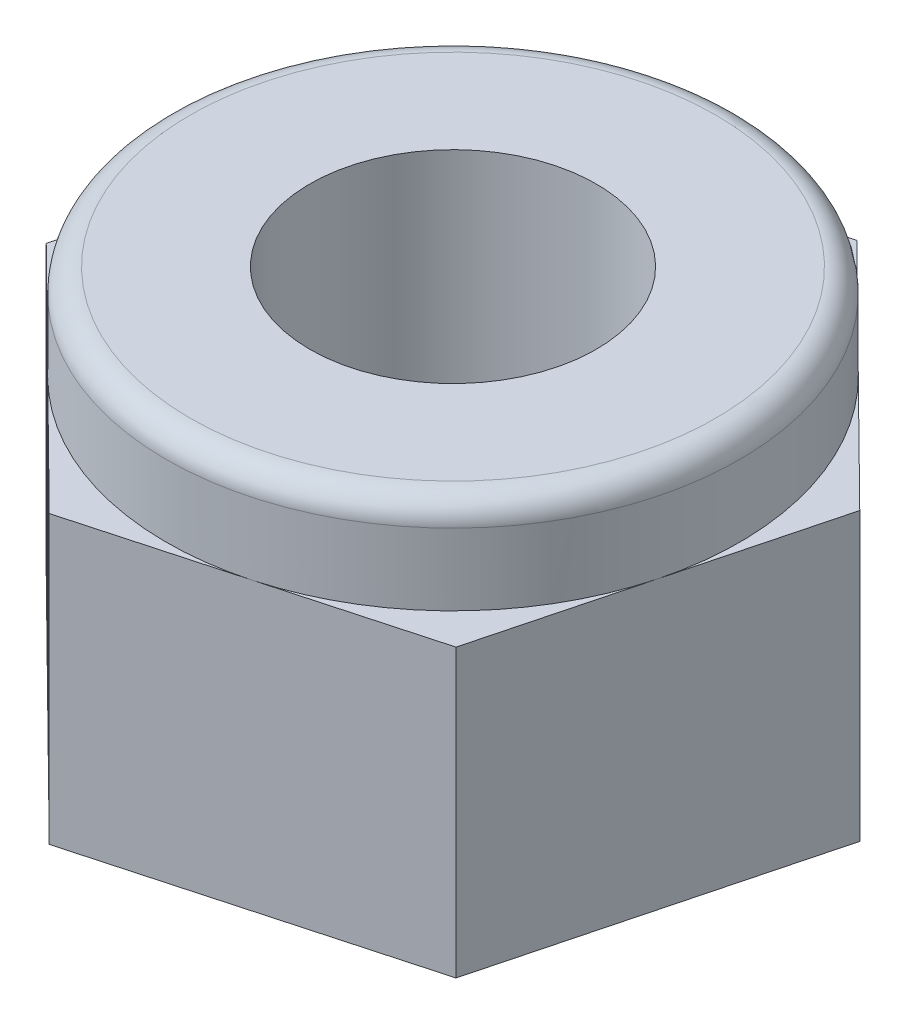
ISO-10303-21;
HEADER;
FILE_DESCRIPTION(('STEP AP214'),'2;1');
FILE_NAME('part.step','',(''),(''),'','','');
FILE_SCHEMA(('AUTOMOTIVE_DESIGN { 1 0 10303 214 1 1 1 1 }'));
ENDSEC;
DATA;
#1=APPLICATION_CONTEXT('core data for automotive mechanical design processes');
#2=APPLICATION_PROTOCOL_DEFINITION('international standard','automotive_design',2000,#1);
#3=PRODUCT_CONTEXT('',#1,'mechanical');
#4=PRODUCT('Part','Part','',(#3));
#5=PRODUCT_RELATED_PRODUCT_CATEGORY('part','',(#4));
#6=PRODUCT_DEFINITION_FORMATION('','',#4);
#7=PRODUCT_DEFINITION_CONTEXT('part definition',#1,'design');
#8=PRODUCT_DEFINITION('design','',#6,#7);
#9=PRODUCT_DEFINITION_SHAPE('','',#8);
#10=(LENGTH_UNIT() NAMED_UNIT(*) SI_UNIT(.MILLI.,.METRE.));
#11=(NAMED_UNIT(*) PLANE_ANGLE_UNIT() SI_UNIT($,.RADIAN.));
#12=(NAMED_UNIT(*) SI_UNIT($,.STERADIAN.) SOLID_ANGLE_UNIT());
#13=UNCERTAINTY_MEASURE_WITH_UNIT(LENGTH_MEASURE(1.E-05),#10,'distance_accuracy_value','');
#14=(GEOMETRIC_REPRESENTATION_CONTEXT(3) GLOBAL_UNCERTAINTY_ASSIGNED_CONTEXT((#13)) GLOBAL_UNIT_ASSIGNED_CONTEXT((#10,
#11,#12)) REPRESENTATION_CONTEXT('',''));
#15=CARTESIAN_POINT('',(0.,0.,0.));
#16=DIRECTION('',(0.,0.,1.));
#17=DIRECTION('',(1.,0.,0.));
#18=AXIS2_PLACEMENT_3D('',#15,#16,#17);
#19=CARTESIAN_POINT('',(0.,3.,0.));
#20=DIRECTION('',(0.,1.,0.));
#21=DIRECTION('',(0.,0.,1.));
#22=AXIS2_PLACEMENT_3D('',#19,#20,#21);
#23=PLANE('',#22);
#24=CARTESIAN_POINT('',(0.,3.,0.));
#25=DIRECTION('',(0.,1.,0.));
#26=DIRECTION('',(0.,0.,1.));
#27=AXIS2_PLACEMENT_3D('',#24,#25,#26);
#28=CIRCLE('',#27,3.00000000000001);
#29=CARTESIAN_POINT('',(0.79508564508505,3.,2.89272169711843));
#30=VERTEX_POINT('',#29);
#31=CARTESIAN_POINT('',(2.90271329832552,3.,0.757796481731226));
#32=VERTEX_POINT('',#31);
#33=EDGE_CURVE('E124',#30,#32,#28,.T.);
#34=ORIENTED_EDGE('',*,*,#33,.F.);
#35=DIRECTION('',(0.964240565706141,0.,-0.265028548361683));
#36=VECTOR('',#35,1.);
#37=CARTESIAN_POINT('',(-0.875028005436949,3.,3.35176460833709));
#38=LINE('',#37,#36);
#39=CARTESIAN_POINT('',(2.46519929560704,3.,2.43367878589977));
#40=VERTEX_POINT('',#39);
#41=EDGE_CURVE('E111',#30,#40,#38,.T.);
#42=ORIENTED_EDGE('',*,*,#41,.T.);
#43=DIRECTION('',(0.252598827243741,0.,-0.967571099441838));
#44=VECTOR('',#43,1.);
#45=CARTESIAN_POINT('',(2.46519929560704,3.,2.43367878589977));
#46=LINE('',#45,#44);
#47=EDGE_CURVE('E125',#40,#32,#46,.T.);
#48=ORIENTED_EDGE('',*,*,#47,.T.);
#49=EDGE_LOOP('',(#34,#42,#48));
#50=FACE_BOUND('',#49,.T.);
#51=ADVANCED_FACE('F33',(#50),#23,.T.);
#52=CARTESIAN_POINT('',(2.10762765324048,3.,-2.1349252153872));
#53=VERTEX_POINT('',#52);
#54=EDGE_CURVE('E131',#32,#53,#28,.T.);
#55=ORIENTED_EDGE('',*,*,#54,.F.);
#56=CARTESIAN_POINT('',(3.34022730104399,3.,-0.918085822437318));
#57=VERTEX_POINT('',#56);
#58=EDGE_CURVE('E110',#32,#57,#46,.T.);
#59=ORIENTED_EDGE('',*,*,#58,.T.);
#60=DIRECTION('',(-0.711641738462399,0.,-0.702542551080157));
#61=VECTOR('',#60,1.);
#62=CARTESIAN_POINT('',(3.34022730104399,3.,-0.918085822437318));
#63=LINE('',#62,#61);
#64=EDGE_CURVE('E142',#57,#53,#63,.T.);
#65=ORIENTED_EDGE('',*,*,#64,.T.);
#66=EDGE_LOOP('',(#55,#59,#65));
#67=FACE_BOUND('',#66,.T.);
#68=ADVANCED_FACE('F222',(#67),#23,.T.);
#69=CARTESIAN_POINT('',(-0.795085645085048,3.,-2.89272169711843));
#70=VERTEX_POINT('',#69);
#71=EDGE_CURVE('E180',#53,#70,#28,.T.);
#72=ORIENTED_EDGE('',*,*,#71,.F.);
#73=CARTESIAN_POINT('',(0.875028005436953,3.,-3.35176460833709));
#74=VERTEX_POINT('',#73);
#75=EDGE_CURVE('E141',#53,#74,#63,.T.);
#76=ORIENTED_EDGE('',*,*,#75,.T.);
#77=DIRECTION('',(-0.964240565706141,0.,0.265028548361682));
#78=VECTOR('',#77,1.);
#79=CARTESIAN_POINT('',(0.875028005436953,3.,-3.35176460833709));
#80=LINE('',#79,#78);
#81=EDGE_CURVE('E146',#74,#70,#80,.T.);
#82=ORIENTED_EDGE('',*,*,#81,.T.);
#83=EDGE_LOOP('',(#72,#76,#82));
#84=FACE_BOUND('',#83,.T.);
#85=ADVANCED_FACE('F191',(#84),#23,.T.);
#86=CARTESIAN_POINT('',(-2.90271329832552,3.,-0.757796481731226));
#87=VERTEX_POINT('',#86);
#88=EDGE_CURVE('E134',#70,#87,#28,.T.);
#89=ORIENTED_EDGE('',*,*,#88,.F.);
#90=CARTESIAN_POINT('',(-2.46519929560704,3.,-2.43367878589978));
#91=VERTEX_POINT('',#90);
#92=EDGE_CURVE('E145',#70,#91,#80,.T.);
#93=ORIENTED_EDGE('',*,*,#92,.T.);
#94=DIRECTION('',(-0.252598827243741,0.,0.967571099441838));
#95=VECTOR('',#94,1.);
#96=CARTESIAN_POINT('',(-2.46519929560704,3.,-2.43367878589978));
#97=LINE('',#96,#95);
#98=EDGE_CURVE('E150',#91,#87,#97,.T.);
#99=ORIENTED_EDGE('',*,*,#98,.T.);
#100=EDGE_LOOP('',(#89,#93,#99));
#101=FACE_BOUND('',#100,.T.);
#102=ADVANCED_FACE('F184',(#101),#23,.T.);
#103=CARTESIAN_POINT('',(-2.10762765324047,3.,2.1349252153872));
#104=VERTEX_POINT('',#103);
#105=EDGE_CURVE('E56',#87,#104,#28,.T.);
#106=ORIENTED_EDGE('',*,*,#105,.F.);
#107=CARTESIAN_POINT('',(-3.34022730104399,3.,0.91808582243732));
#108=VERTEX_POINT('',#107);
#109=EDGE_CURVE('E149',#87,#108,#97,.T.);
#110=ORIENTED_EDGE('',*,*,#109,.T.);
#111=DIRECTION('',(0.7116417384624,0.,0.702542551080156));
#112=VECTOR('',#111,1.);
#113=CARTESIAN_POINT('',(-3.34022730104399,3.,0.91808582243732));
#114=LINE('',#113,#112);
#115=EDGE_CURVE('E153',#108,#104,#114,.T.);
#116=ORIENTED_EDGE('',*,*,#115,.T.);
#117=EDGE_LOOP('',(#106,#110,#116));
#118=FACE_BOUND('',#117,.T.);
#119=ADVANCED_FACE('F210',(#118),#23,.T.);
#120=CARTESIAN_POINT('',(-0.875028005436949,3.,3.35176460833709));
#121=DIRECTION('',(-0.265028548361683,0.,-0.964240565706141));
#122=DIRECTION('',(-0.964240565706141,0.,0.265028548361683));
#123=AXIS2_PLACEMENT_3D('',#120,#121,#122);
#124=PLANE('',#123);
#125=DIRECTION('',(0.964240565706141,0.,-0.265028548361683));
#126=VECTOR('',#125,1.);
#127=CARTESIAN_POINT('',(-0.875028005436949,0.,3.35176460833709));
#128=LINE('',#127,#126);
#129=CARTESIAN_POINT('',(-0.875028005436949,0.,3.35176460833709));
#130=VERTEX_POINT('',#129);
#131=CARTESIAN_POINT('',(2.46519929560704,0.,2.43367878589977));
#132=VERTEX_POINT('',#131);
#133=EDGE_CURVE('E128',#130,#132,#128,.T.);
#134=ORIENTED_EDGE('',*,*,#133,.T.);
#135=DIRECTION('',(0.,-1.,0.));
#136=VECTOR('',#135,1.);
#137=CARTESIAN_POINT('',(2.46519929560704,3.,2.43367878589977));
#138=LINE('',#137,#136);
#139=EDGE_CURVE('E118',#40,#132,#138,.T.);
#140=ORIENTED_EDGE('',*,*,#139,.F.);
#141=ORIENTED_EDGE('',*,*,#41,.F.);
#142=CARTESIAN_POINT('',(-0.875028005436949,3.,3.35176460833709));
#143=VERTEX_POINT('',#142);
#144=EDGE_CURVE('E103',#143,#30,#38,.T.);
#145=ORIENTED_EDGE('',*,*,#144,.F.);
#146=DIRECTION('',(0.,-1.,0.));
#147=VECTOR('',#146,1.);
#148=CARTESIAN_POINT('',(-0.875028005436949,3.,3.35176460833709));
#149=LINE('',#148,#147);
#150=EDGE_CURVE('E155',#143,#130,#149,.T.);
#151=ORIENTED_EDGE('',*,*,#150,.T.);
#152=EDGE_LOOP('',(#134,#140,#141,#145,#151));
#153=FACE_BOUND('',#152,.T.);
#154=ADVANCED_FACE('F116',(#153),#124,.F.);
#155=CARTESIAN_POINT('',(2.46519929560704,3.,2.43367878589977));
#156=DIRECTION('',(-0.967571099441838,0.,-0.252598827243741));
#157=DIRECTION('',(-0.252598827243741,0.,0.967571099441838));
#158=AXIS2_PLACEMENT_3D('',#155,#156,#157);
#159=PLANE('',#158);
#160=DIRECTION('',(0.252598827243741,0.,-0.967571099441838));
#161=VECTOR('',#160,1.);
#162=CARTESIAN_POINT('',(2.46519929560704,0.,2.43367878589977));
#163=LINE('',#162,#161);
#164=CARTESIAN_POINT('',(3.34022730104399,0.,-0.918085822437318));
#165=VERTEX_POINT('',#164);
#166=EDGE_CURVE('E157',#132,#165,#163,.T.);
#167=ORIENTED_EDGE('',*,*,#166,.T.);
#168=DIRECTION('',(0.,-1.,0.));
#169=VECTOR('',#168,1.);
#170=CARTESIAN_POINT('',(3.34022730104399,3.,-0.918085822437318));
#171=LINE('',#170,#169);
#172=EDGE_CURVE('E135',#57,#165,#171,.T.);
#173=ORIENTED_EDGE('',*,*,#172,.F.);
#174=ORIENTED_EDGE('',*,*,#58,.F.);
#175=ORIENTED_EDGE('',*,*,#47,.F.);
#176=ORIENTED_EDGE('',*,*,#139,.T.);
#177=EDGE_LOOP('',(#167,#173,#174,#175,#176));
#178=FACE_BOUND('',#177,.T.);
#179=ADVANCED_FACE('F217',(#178),#159,.F.);
#180=CARTESIAN_POINT('',(3.34022730104399,3.,-0.918085822437318));
#181=DIRECTION('',(-0.702542551080157,0.,0.711641738462399));
#182=DIRECTION('',(0.711641738462399,0.,0.702542551080157));
#183=AXIS2_PLACEMENT_3D('',#180,#181,#182);
#184=PLANE('',#183);
#185=DIRECTION('',(-0.711641738462399,0.,-0.702542551080157));
#186=VECTOR('',#185,1.);
#187=CARTESIAN_POINT('',(3.34022730104399,0.,-0.918085822437318));
#188=LINE('',#187,#186);
#189=CARTESIAN_POINT('',(0.875028005436953,0.,-3.35176460833709));
#190=VERTEX_POINT('',#189);
#191=EDGE_CURVE('E159',#165,#190,#188,.T.);
#192=ORIENTED_EDGE('',*,*,#191,.T.);
#193=DIRECTION('',(0.,-1.,0.));
#194=VECTOR('',#193,1.);
#195=CARTESIAN_POINT('',(0.875028005436953,3.,-3.35176460833709));
#196=LINE('',#195,#194);
#197=EDGE_CURVE('E173',#74,#190,#196,.T.);
#198=ORIENTED_EDGE('',*,*,#197,.F.);
#199=ORIENTED_EDGE('',*,*,#75,.F.);
#200=ORIENTED_EDGE('',*,*,#64,.F.);
#201=ORIENTED_EDGE('',*,*,#172,.T.);
#202=EDGE_LOOP('',(#192,#198,#199,#200,#201));
#203=FACE_BOUND('',#202,.T.);
#204=ADVANCED_FACE('F196',(#203),#184,.F.);
#205=CARTESIAN_POINT('',(0.875028005436953,3.,-3.35176460833709));
#206=DIRECTION('',(0.265028548361682,0.,0.964240565706141));
#207=DIRECTION('',(0.964240565706142,0.,-0.265028548361682));
#208=AXIS2_PLACEMENT_3D('',#205,#206,#207);
#209=PLANE('',#208);
#210=DIRECTION('',(-0.964240565706141,0.,0.265028548361682));
#211=VECTOR('',#210,1.);
#212=CARTESIAN_POINT('',(0.875028005436953,0.,-3.35176460833709));
#213=LINE('',#212,#211);
#214=CARTESIAN_POINT('',(-2.46519929560704,0.,-2.43367878589978));
#215=VERTEX_POINT('',#214);
#216=EDGE_CURVE('E161',#190,#215,#213,.T.);
#217=ORIENTED_EDGE('',*,*,#216,.T.);
#218=DIRECTION('',(0.,-1.,0.));
#219=VECTOR('',#218,1.);
#220=CARTESIAN_POINT('',(-2.46519929560704,3.,-2.43367878589978));
#221=LINE('',#220,#219);
#222=EDGE_CURVE('E170',#91,#215,#221,.T.);
#223=ORIENTED_EDGE('',*,*,#222,.F.);
#224=ORIENTED_EDGE('',*,*,#92,.F.);
#225=ORIENTED_EDGE('',*,*,#81,.F.);
#226=ORIENTED_EDGE('',*,*,#197,.T.);
#227=EDGE_LOOP('',(#217,#223,#224,#225,#226));
#228=FACE_BOUND('',#227,.T.);
#229=ADVANCED_FACE('F189',(#228),#209,.F.);
#230=CARTESIAN_POINT('',(-2.46519929560704,3.,-2.43367878589978));
#231=DIRECTION('',(0.967571099441838,0.,0.252598827243741));
#232=DIRECTION('',(0.252598827243741,0.,-0.967571099441838));
#233=AXIS2_PLACEMENT_3D('',#230,#231,#232);
#234=PLANE('',#233);
#235=DIRECTION('',(-0.252598827243741,0.,0.967571099441838));
#236=VECTOR('',#235,1.);
#237=CARTESIAN_POINT('',(-2.46519929560704,0.,-2.43367878589978));
#238=LINE('',#237,#236);
#239=CARTESIAN_POINT('',(-3.34022730104399,0.,0.91808582243732));
#240=VERTEX_POINT('',#239);
#241=EDGE_CURVE('E163',#215,#240,#238,.T.);
#242=ORIENTED_EDGE('',*,*,#241,.T.);
#243=DIRECTION('',(0.,-1.,0.));
#244=VECTOR('',#243,1.);
#245=CARTESIAN_POINT('',(-3.34022730104399,3.,0.91808582243732));
#246=LINE('',#245,#244);
#247=EDGE_CURVE('E167',#108,#240,#246,.T.);
#248=ORIENTED_EDGE('',*,*,#247,.F.);
#249=ORIENTED_EDGE('',*,*,#109,.F.);
#250=ORIENTED_EDGE('',*,*,#98,.F.);
#251=ORIENTED_EDGE('',*,*,#222,.T.);
#252=EDGE_LOOP('',(#242,#248,#249,#250,#251));
#253=FACE_BOUND('',#252,.T.);
#254=ADVANCED_FACE('F206',(#253),#234,.F.);
#255=CARTESIAN_POINT('',(-3.34022730104399,3.,0.91808582243732));
#256=DIRECTION('',(0.702542551080156,0.,-0.7116417384624));
#257=DIRECTION('',(-0.7116417384624,0.,-0.702542551080156));
#258=AXIS2_PLACEMENT_3D('',#255,#256,#257);
#259=PLANE('',#258);
#260=DIRECTION('',(0.7116417384624,0.,0.702542551080156));
#261=VECTOR('',#260,1.);
#262=CARTESIAN_POINT('',(-3.34022730104399,0.,0.91808582243732));
#263=LINE('',#262,#261);
#264=EDGE_CURVE('E122',#240,#130,#263,.T.);
#265=ORIENTED_EDGE('',*,*,#264,.T.);
#266=ORIENTED_EDGE('',*,*,#150,.F.);
#267=EDGE_CURVE('E106',#104,#143,#114,.T.);
#268=ORIENTED_EDGE('',*,*,#267,.F.);
#269=ORIENTED_EDGE('',*,*,#115,.F.);
#270=ORIENTED_EDGE('',*,*,#247,.T.);
#271=EDGE_LOOP('',(#265,#266,#268,#269,#270));
#272=FACE_BOUND('',#271,.T.);
#273=ADVANCED_FACE('F209',(#272),#259,.F.);
#274=EDGE_CURVE('E48',#104,#30,#28,.T.);
#275=ORIENTED_EDGE('',*,*,#274,.F.);
#276=ORIENTED_EDGE('',*,*,#267,.T.);
#277=ORIENTED_EDGE('',*,*,#144,.T.);
#278=EDGE_LOOP('',(#275,#276,#277));
#279=FACE_BOUND('',#278,.T.);
#280=ADVANCED_FACE('F105',(#279),#23,.T.);
#281=CARTESIAN_POINT('',(0.,0.,0.));
#282=DIRECTION('',(0.,1.,0.));
#283=DIRECTION('',(0.,0.,1.));
#284=AXIS2_PLACEMENT_3D('',#281,#282,#283);
#285=PLANE('',#284);
#286=CARTESIAN_POINT('',(0.,0.,0.));
#287=DIRECTION('',(0.,1.,0.));
#288=DIRECTION('',(0.,0.,1.));
#289=AXIS2_PLACEMENT_3D('',#286,#287,#288);
#290=CIRCLE('',#289,1.5);
#291=CARTESIAN_POINT('',(0.,0.,1.5));
#292=VERTEX_POINT('',#291);
#293=EDGE_CURVE('E129',#292,#292,#290,.F.);
#294=ORIENTED_EDGE('',*,*,#293,.F.);
#295=EDGE_LOOP('',(#294));
#296=FACE_BOUND('',#295,.T.);
#297=ORIENTED_EDGE('',*,*,#133,.F.);
#298=ORIENTED_EDGE('',*,*,#264,.F.);
#299=ORIENTED_EDGE('',*,*,#241,.F.);
#300=ORIENTED_EDGE('',*,*,#216,.F.);
#301=ORIENTED_EDGE('',*,*,#191,.F.);
#302=ORIENTED_EDGE('',*,*,#166,.F.);
#303=EDGE_LOOP('',(#297,#298,#299,#300,#301,#302));
#304=FACE_BOUND('',#303,.T.);
#305=ADVANCED_FACE('F202',(#296,#304),#285,.F.);
#306=CARTESIAN_POINT('',(0.,4.,0.));
#307=DIRECTION('',(0.,-1.,0.));
#308=DIRECTION('',(0.,0.,-1.));
#309=AXIS2_PLACEMENT_3D('',#306,#307,#308);
#310=CYLINDRICAL_SURFACE('',#309,3.00000000000001);
#311=CARTESIAN_POINT('',(0.,3.75,0.));
#312=DIRECTION('',(0.,1.,0.));
#313=DIRECTION('',(0.,0.,1.));
#314=AXIS2_PLACEMENT_3D('',#311,#312,#313);
#315=CIRCLE('',#314,3.00000000000001);
#316=CARTESIAN_POINT('',(0.,3.75,3.00000000000001));
#317=VERTEX_POINT('',#316);
#318=EDGE_CURVE('E11',#317,#317,#315,.F.);
#319=ORIENTED_EDGE('',*,*,#318,.T.);
#320=EDGE_LOOP('',(#319));
#321=FACE_BOUND('',#320,.T.);
#322=ORIENTED_EDGE('',*,*,#33,.T.);
#323=ORIENTED_EDGE('',*,*,#54,.T.);
#324=ORIENTED_EDGE('',*,*,#71,.T.);
#325=ORIENTED_EDGE('',*,*,#88,.T.);
#326=ORIENTED_EDGE('',*,*,#105,.T.);
#327=ORIENTED_EDGE('',*,*,#274,.T.);
#328=EDGE_LOOP('',(#322,#323,#324,#325,#326,#327));
#329=FACE_BOUND('',#328,.T.);
#330=ADVANCED_FACE('F132',(#321,#329),#310,.T.);
#331=CARTESIAN_POINT('',(0.,4.,0.));
#332=DIRECTION('',(0.,1.,0.));
#333=DIRECTION('',(0.,0.,1.));
#334=AXIS2_PLACEMENT_3D('',#331,#332,#333);
#335=PLANE('',#334);
#336=CARTESIAN_POINT('',(0.,4.,0.));
#337=DIRECTION('',(0.,1.,0.));
#338=DIRECTION('',(0.,0.,1.));
#339=AXIS2_PLACEMENT_3D('',#336,#337,#338);
#340=CIRCLE('',#339,2.75000000000001);
#341=CARTESIAN_POINT('',(0.,4.,2.75000000000001));
#342=VERTEX_POINT('',#341);
#343=EDGE_CURVE('E41',#342,#342,#340,.T.);
#344=ORIENTED_EDGE('',*,*,#343,.T.);
#345=EDGE_LOOP('',(#344));
#346=FACE_BOUND('',#345,.T.);
#347=CARTESIAN_POINT('',(0.,4.,0.));
#348=DIRECTION('',(0.,1.,0.));
#349=DIRECTION('',(0.,0.,1.));
#350=AXIS2_PLACEMENT_3D('',#347,#348,#349);
#351=CIRCLE('',#350,1.5);
#352=CARTESIAN_POINT('',(0.,4.,1.5));
#353=VERTEX_POINT('',#352);
#354=EDGE_CURVE('E255',#353,#353,#351,.T.);
#355=ORIENTED_EDGE('',*,*,#354,.F.);
#356=EDGE_LOOP('',(#355));
#357=FACE_BOUND('',#356,.T.);
#358=ADVANCED_FACE('F250',(#346,#357),#335,.T.);
#359=CARTESIAN_POINT('',(0.,-0.00100000000000013,0.));
#360=DIRECTION('',(0.,1.,0.));
#361=DIRECTION('',(0.,0.,1.));
#362=AXIS2_PLACEMENT_3D('',#359,#360,#361);
#363=CYLINDRICAL_SURFACE('',#362,1.5);
#364=ORIENTED_EDGE('',*,*,#354,.T.);
#365=EDGE_LOOP('',(#364));
#366=FACE_BOUND('',#365,.T.);
#367=ORIENTED_EDGE('',*,*,#293,.T.);
#368=EDGE_LOOP('',(#367));
#369=FACE_BOUND('',#368,.T.);
#370=ADVANCED_FACE('F259',(#366,#369),#363,.F.);
#371=CARTESIAN_POINT('',(0.,3.75,0.));
#372=DIRECTION('',(0.,1.,0.));
#373=DIRECTION('',(0.,0.,1.));
#374=AXIS2_PLACEMENT_3D('',#371,#372,#373);
#375=TOROIDAL_SURFACE('',#374,2.75000000000001,0.25);
#376=ORIENTED_EDGE('',*,*,#318,.F.);
#377=EDGE_LOOP('',(#376));
#378=FACE_BOUND('',#377,.T.);
#379=ORIENTED_EDGE('',*,*,#343,.F.);
#380=EDGE_LOOP('',(#379));
#381=FACE_BOUND('',#380,.T.);
#382=ADVANCED_FACE('F35',(#378,#381),#375,.T.);
#383=CLOSED_SHELL('',(#51,#68,#85,#102,#119,#154,#179,#204,#229,#254,#273,#280,#305,#330,#358,
#370,#382));
#384=MANIFOLD_SOLID_BREP('B2',#383);
#385=ADVANCED_BREP_SHAPE_REPRESENTATION('',(#18,#384),#14);
#386=SHAPE_DEFINITION_REPRESENTATION(#9,#385);
ENDSEC;
END-ISO-10303-21;
